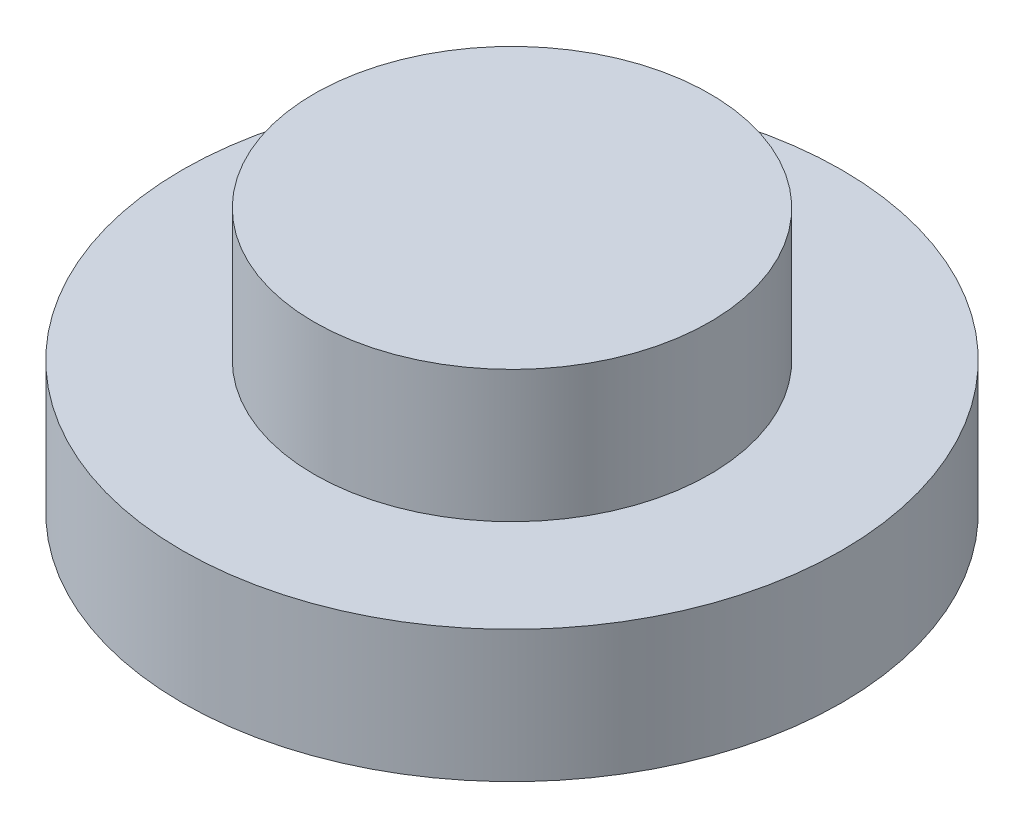
ISO-10303-21;
HEADER;
FILE_DESCRIPTION(('STEP AP214'),'2;1');
FILE_NAME('part.step','',(''),(''),'','','');
FILE_SCHEMA(('AUTOMOTIVE_DESIGN { 1 0 10303 214 1 1 1 1 }'));
ENDSEC;
DATA;
#1=APPLICATION_CONTEXT('core data for automotive mechanical design processes');
#2=APPLICATION_PROTOCOL_DEFINITION('international standard','automotive_design',2000,#1);
#3=PRODUCT_CONTEXT('',#1,'mechanical');
#4=PRODUCT('Part','Part','',(#3));
#5=PRODUCT_RELATED_PRODUCT_CATEGORY('part','',(#4));
#6=PRODUCT_DEFINITION_FORMATION('','',#4);
#7=PRODUCT_DEFINITION_CONTEXT('part definition',#1,'design');
#8=PRODUCT_DEFINITION('design','',#6,#7);
#9=PRODUCT_DEFINITION_SHAPE('','',#8);
#10=(LENGTH_UNIT() NAMED_UNIT(*) SI_UNIT(.MILLI.,.METRE.));
#11=(NAMED_UNIT(*) PLANE_ANGLE_UNIT() SI_UNIT($,.RADIAN.));
#12=(NAMED_UNIT(*) SI_UNIT($,.STERADIAN.) SOLID_ANGLE_UNIT());
#13=UNCERTAINTY_MEASURE_WITH_UNIT(LENGTH_MEASURE(1.E-05),#10,'distance_accuracy_value','');
#14=(GEOMETRIC_REPRESENTATION_CONTEXT(3) GLOBAL_UNCERTAINTY_ASSIGNED_CONTEXT((#13)) GLOBAL_UNIT_ASSIGNED_CONTEXT((#10,
#11,#12)) REPRESENTATION_CONTEXT('',''));
#15=CARTESIAN_POINT('',(0.,0.,0.));
#16=DIRECTION('',(0.,0.,1.));
#17=DIRECTION('',(1.,0.,0.));
#18=AXIS2_PLACEMENT_3D('',#15,#16,#17);
#19=CARTESIAN_POINT('',(0.,0.,0.));
#20=DIRECTION('',(0.,1.,0.));
#21=DIRECTION('',(0.,0.,1.));
#22=AXIS2_PLACEMENT_3D('',#19,#20,#21);
#23=PLANE('',#22);
#24=CARTESIAN_POINT('',(0.,0.,0.));
#25=DIRECTION('',(0.,1.,0.));
#26=DIRECTION('',(0.,0.,1.));
#27=AXIS2_PLACEMENT_3D('',#24,#25,#26);
#28=CIRCLE('',#27,25.);
#29=CARTESIAN_POINT('',(0.,0.,25.));
#30=VERTEX_POINT('',#29);
#31=EDGE_CURVE('E41',#30,#30,#28,.T.);
#32=ORIENTED_EDGE('',*,*,#31,.F.);
#33=EDGE_LOOP('',(#32));
#34=FACE_BOUND('',#33,.T.);
#35=DIRECTION('',(0.,0.,1.));
#36=VECTOR('',#35,1.);
#37=CARTESIAN_POINT('',(5.,0.,5.));
#38=LINE('',#37,#36);
#39=CARTESIAN_POINT('',(5.,0.,-5.));
#40=VERTEX_POINT('',#39);
#41=CARTESIAN_POINT('',(5.,0.,5.));
#42=VERTEX_POINT('',#41);
#43=EDGE_CURVE('E54',#40,#42,#38,.T.);
#44=ORIENTED_EDGE('',*,*,#43,.F.);
#45=DIRECTION('',(1.,0.,0.));
#46=VECTOR('',#45,1.);
#47=CARTESIAN_POINT('',(-5.,0.,-5.));
#48=LINE('',#47,#46);
#49=CARTESIAN_POINT('',(-5.,0.,-5.));
#50=VERTEX_POINT('',#49);
#51=EDGE_CURVE('E58',#50,#40,#48,.T.);
#52=ORIENTED_EDGE('',*,*,#51,.F.);
#53=DIRECTION('',(0.,0.,-1.));
#54=VECTOR('',#53,1.);
#55=CARTESIAN_POINT('',(-5.,0.,5.));
#56=LINE('',#55,#54);
#57=CARTESIAN_POINT('',(-5.,0.,5.));
#58=VERTEX_POINT('',#57);
#59=EDGE_CURVE('E226',#58,#50,#56,.T.);
#60=ORIENTED_EDGE('',*,*,#59,.F.);
#61=DIRECTION('',(-1.,0.,0.));
#62=VECTOR('',#61,1.);
#63=CARTESIAN_POINT('',(-5.,0.,5.));
#64=LINE('',#63,#62);
#65=EDGE_CURVE('E232',#42,#58,#64,.T.);
#66=ORIENTED_EDGE('',*,*,#65,.F.);
#67=EDGE_LOOP('',(#44,#52,#60,#66));
#68=FACE_BOUND('',#67,.T.);
#69=ADVANCED_FACE('F37',(#34,#68),#23,.F.);
#70=CARTESIAN_POINT('',(0.,10.,0.));
#71=DIRECTION('',(0.,-1.,0.));
#72=DIRECTION('',(0.,0.,-1.));
#73=AXIS2_PLACEMENT_3D('',#70,#71,#72);
#74=CYLINDRICAL_SURFACE('',#73,25.);
#75=CARTESIAN_POINT('',(0.,10.,0.));
#76=DIRECTION('',(0.,1.,0.));
#77=DIRECTION('',(0.,0.,1.));
#78=AXIS2_PLACEMENT_3D('',#75,#76,#77);
#79=CIRCLE('',#78,25.);
#80=CARTESIAN_POINT('',(0.,10.,25.));
#81=VERTEX_POINT('',#80);
#82=EDGE_CURVE('E46',#81,#81,#79,.T.);
#83=ORIENTED_EDGE('',*,*,#82,.F.);
#84=EDGE_LOOP('',(#83));
#85=FACE_BOUND('',#84,.T.);
#86=ORIENTED_EDGE('',*,*,#31,.T.);
#87=EDGE_LOOP('',(#86));
#88=FACE_BOUND('',#87,.T.);
#89=ADVANCED_FACE('F39',(#85,#88),#74,.T.);
#90=CARTESIAN_POINT('',(0.,10.,0.));
#91=DIRECTION('',(0.,1.,0.));
#92=DIRECTION('',(0.,0.,1.));
#93=AXIS2_PLACEMENT_3D('',#90,#91,#92);
#94=PLANE('',#93);
#95=CARTESIAN_POINT('',(0.,10.,0.));
#96=DIRECTION('',(0.,1.,0.));
#97=DIRECTION('',(0.,0.,1.));
#98=AXIS2_PLACEMENT_3D('',#95,#96,#97);
#99=CIRCLE('',#98,15.);
#100=CARTESIAN_POINT('',(0.,10.,15.));
#101=VERTEX_POINT('',#100);
#102=EDGE_CURVE('E11',#101,#101,#99,.T.);
#103=ORIENTED_EDGE('',*,*,#102,.F.);
#104=EDGE_LOOP('',(#103));
#105=FACE_BOUND('',#104,.T.);
#106=ORIENTED_EDGE('',*,*,#82,.T.);
#107=EDGE_LOOP('',(#106));
#108=FACE_BOUND('',#107,.T.);
#109=ADVANCED_FACE('F118',(#105,#108),#94,.T.);
#110=CARTESIAN_POINT('',(0.,20.,0.));
#111=DIRECTION('',(0.,-1.,0.));
#112=DIRECTION('',(0.,0.,-1.));
#113=AXIS2_PLACEMENT_3D('',#110,#111,#112);
#114=CYLINDRICAL_SURFACE('',#113,15.);
#115=CARTESIAN_POINT('',(0.,20.,0.));
#116=DIRECTION('',(0.,1.,0.));
#117=DIRECTION('',(0.,0.,1.));
#118=AXIS2_PLACEMENT_3D('',#115,#116,#117);
#119=CIRCLE('',#118,15.);
#120=CARTESIAN_POINT('',(0.,20.,15.));
#121=VERTEX_POINT('',#120);
#122=EDGE_CURVE('E100',#121,#121,#119,.T.);
#123=ORIENTED_EDGE('',*,*,#122,.F.);
#124=EDGE_LOOP('',(#123));
#125=FACE_BOUND('',#124,.T.);
#126=ORIENTED_EDGE('',*,*,#102,.T.);
#127=EDGE_LOOP('',(#126));
#128=FACE_BOUND('',#127,.T.);
#129=ADVANCED_FACE('F123',(#125,#128),#114,.T.);
#130=CARTESIAN_POINT('',(0.,20.,0.));
#131=DIRECTION('',(0.,1.,0.));
#132=DIRECTION('',(0.,0.,1.));
#133=AXIS2_PLACEMENT_3D('',#130,#131,#132);
#134=PLANE('',#133);
#135=ORIENTED_EDGE('',*,*,#122,.T.);
#136=EDGE_LOOP('',(#135));
#137=FACE_BOUND('',#136,.T.);
#138=ADVANCED_FACE('F127',(#137),#134,.T.);
#139=CARTESIAN_POINT('',(5.,-2.,5.));
#140=DIRECTION('',(-1.,0.,0.));
#141=DIRECTION('',(0.,0.,1.));
#142=AXIS2_PLACEMENT_3D('',#139,#140,#141);
#143=PLANE('',#142);
#144=ORIENTED_EDGE('',*,*,#43,.T.);
#145=DIRECTION('',(0.,1.,0.));
#146=VECTOR('',#145,1.);
#147=CARTESIAN_POINT('',(5.,-2.,5.));
#148=LINE('',#147,#146);
#149=CARTESIAN_POINT('',(5.,-2.,5.));
#150=VERTEX_POINT('',#149);
#151=EDGE_CURVE('E83',#150,#42,#148,.T.);
#152=ORIENTED_EDGE('',*,*,#151,.F.);
#153=DIRECTION('',(0.,0.,1.));
#154=VECTOR('',#153,1.);
#155=CARTESIAN_POINT('',(5.,-2.,5.));
#156=LINE('',#155,#154);
#157=CARTESIAN_POINT('',(5.,-2.,-5.));
#158=VERTEX_POINT('',#157);
#159=EDGE_CURVE('E89',#158,#150,#156,.T.);
#160=ORIENTED_EDGE('',*,*,#159,.F.);
#161=DIRECTION('',(0.,1.,0.));
#162=VECTOR('',#161,1.);
#163=CARTESIAN_POINT('',(5.,-2.,-5.));
#164=LINE('',#163,#162);
#165=EDGE_CURVE('E224',#158,#40,#164,.T.);
#166=ORIENTED_EDGE('',*,*,#165,.T.);
#167=EDGE_LOOP('',(#144,#152,#160,#166));
#168=FACE_BOUND('',#167,.T.);
#169=ADVANCED_FACE('F99',(#168),#143,.F.);
#170=CARTESIAN_POINT('',(-5.,-2.,5.));
#171=DIRECTION('',(0.,0.,-1.));
#172=DIRECTION('',(-1.,0.,0.));
#173=AXIS2_PLACEMENT_3D('',#170,#171,#172);
#174=PLANE('',#173);
#175=ORIENTED_EDGE('',*,*,#65,.T.);
#176=DIRECTION('',(0.,1.,0.));
#177=VECTOR('',#176,1.);
#178=CARTESIAN_POINT('',(-5.,-2.,5.));
#179=LINE('',#178,#177);
#180=CARTESIAN_POINT('',(-5.,-2.,5.));
#181=VERTEX_POINT('',#180);
#182=EDGE_CURVE('E85',#181,#58,#179,.T.);
#183=ORIENTED_EDGE('',*,*,#182,.F.);
#184=DIRECTION('',(-1.,0.,0.));
#185=VECTOR('',#184,1.);
#186=CARTESIAN_POINT('',(-5.,-2.,5.));
#187=LINE('',#186,#185);
#188=EDGE_CURVE('E78',#150,#181,#187,.T.);
#189=ORIENTED_EDGE('',*,*,#188,.F.);
#190=ORIENTED_EDGE('',*,*,#151,.T.);
#191=EDGE_LOOP('',(#175,#183,#189,#190));
#192=FACE_BOUND('',#191,.T.);
#193=ADVANCED_FACE('F81',(#192),#174,.F.);
#194=CARTESIAN_POINT('',(-5.,-2.,5.));
#195=DIRECTION('',(1.,0.,0.));
#196=DIRECTION('',(0.,0.,-1.));
#197=AXIS2_PLACEMENT_3D('',#194,#195,#196);
#198=PLANE('',#197);
#199=ORIENTED_EDGE('',*,*,#59,.T.);
#200=DIRECTION('',(0.,1.,0.));
#201=VECTOR('',#200,1.);
#202=CARTESIAN_POINT('',(-5.,-2.,-5.));
#203=LINE('',#202,#201);
#204=CARTESIAN_POINT('',(-5.,-2.,-5.));
#205=VERTEX_POINT('',#204);
#206=EDGE_CURVE('E104',#205,#50,#203,.T.);
#207=ORIENTED_EDGE('',*,*,#206,.F.);
#208=DIRECTION('',(0.,0.,-1.));
#209=VECTOR('',#208,1.);
#210=CARTESIAN_POINT('',(-5.,-2.,5.));
#211=LINE('',#210,#209);
#212=EDGE_CURVE('E88',#181,#205,#211,.T.);
#213=ORIENTED_EDGE('',*,*,#212,.F.);
#214=ORIENTED_EDGE('',*,*,#182,.T.);
#215=EDGE_LOOP('',(#199,#207,#213,#214));
#216=FACE_BOUND('',#215,.T.);
#217=ADVANCED_FACE('F136',(#216),#198,.F.);
#218=CARTESIAN_POINT('',(-5.,-2.,-5.));
#219=DIRECTION('',(0.,0.,1.));
#220=DIRECTION('',(1.,0.,0.));
#221=AXIS2_PLACEMENT_3D('',#218,#219,#220);
#222=PLANE('',#221);
#223=ORIENTED_EDGE('',*,*,#51,.T.);
#224=ORIENTED_EDGE('',*,*,#165,.F.);
#225=DIRECTION('',(1.,0.,0.));
#226=VECTOR('',#225,1.);
#227=CARTESIAN_POINT('',(-5.,-2.,-5.));
#228=LINE('',#227,#226);
#229=EDGE_CURVE('E94',#205,#158,#228,.T.);
#230=ORIENTED_EDGE('',*,*,#229,.F.);
#231=ORIENTED_EDGE('',*,*,#206,.T.);
#232=EDGE_LOOP('',(#223,#224,#230,#231));
#233=FACE_BOUND('',#232,.T.);
#234=ADVANCED_FACE('F139',(#233),#222,.F.);
#235=CARTESIAN_POINT('',(0.,-2.,0.));
#236=DIRECTION('',(0.,-1.,0.));
#237=DIRECTION('',(0.,0.,-1.));
#238=AXIS2_PLACEMENT_3D('',#235,#236,#237);
#239=PLANE('',#238);
#240=ORIENTED_EDGE('',*,*,#159,.T.);
#241=ORIENTED_EDGE('',*,*,#188,.T.);
#242=ORIENTED_EDGE('',*,*,#212,.T.);
#243=ORIENTED_EDGE('',*,*,#229,.T.);
#244=EDGE_LOOP('',(#240,#241,#242,#243));
#245=FACE_BOUND('',#244,.T.);
#246=ADVANCED_FACE('F92',(#245),#239,.T.);
#247=CLOSED_SHELL('',(#69,#89,#109,#129,#138,#169,#193,#217,#234,#246));
#248=MANIFOLD_SOLID_BREP('B2',#247);
#249=ADVANCED_BREP_SHAPE_REPRESENTATION('',(#18,#248),#14);
#250=SHAPE_DEFINITION_REPRESENTATION(#9,#249);
ENDSEC;
END-ISO-10303-21;
